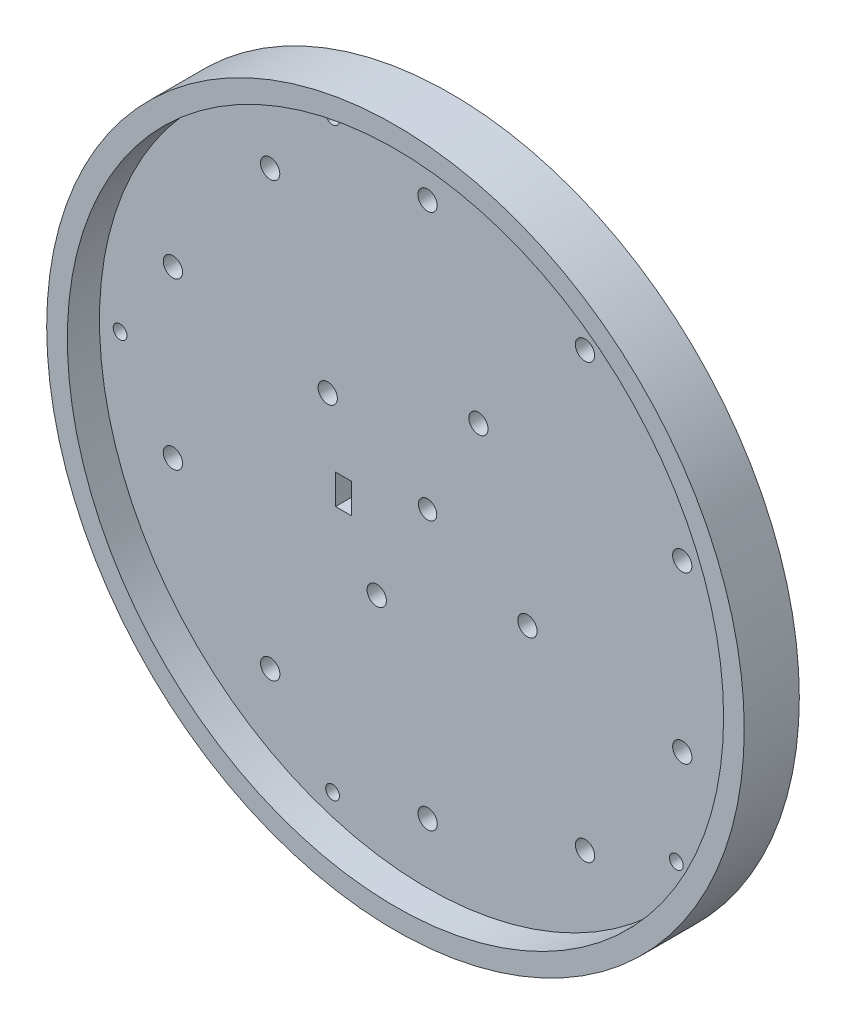
ISO-10303-21;
HEADER;
FILE_DESCRIPTION(('STEP AP214'),'2;1');
FILE_NAME('part.step','',(''),(''),'','','');
FILE_SCHEMA(('AUTOMOTIVE_DESIGN { 1 0 10303 214 1 1 1 1 }'));
ENDSEC;
DATA;
#1=APPLICATION_CONTEXT('core data for automotive mechanical design processes');
#2=APPLICATION_PROTOCOL_DEFINITION('international standard','automotive_design',2000,#1);
#3=PRODUCT_CONTEXT('',#1,'mechanical');
#4=PRODUCT('Part','Part','',(#3));
#5=PRODUCT_RELATED_PRODUCT_CATEGORY('part','',(#4));
#6=PRODUCT_DEFINITION_FORMATION('','',#4);
#7=PRODUCT_DEFINITION_CONTEXT('part definition',#1,'design');
#8=PRODUCT_DEFINITION('design','',#6,#7);
#9=PRODUCT_DEFINITION_SHAPE('','',#8);
#10=(LENGTH_UNIT() NAMED_UNIT(*) SI_UNIT(.MILLI.,.METRE.));
#11=(NAMED_UNIT(*) PLANE_ANGLE_UNIT() SI_UNIT($,.RADIAN.));
#12=(NAMED_UNIT(*) SI_UNIT($,.STERADIAN.) SOLID_ANGLE_UNIT());
#13=UNCERTAINTY_MEASURE_WITH_UNIT(LENGTH_MEASURE(1.E-05),#10,'distance_accuracy_value','');
#14=(GEOMETRIC_REPRESENTATION_CONTEXT(3) GLOBAL_UNCERTAINTY_ASSIGNED_CONTEXT((#13)) GLOBAL_UNIT_ASSIGNED_CONTEXT((#10,
#11,#12)) REPRESENTATION_CONTEXT('',''));
#15=CARTESIAN_POINT('',(0.,0.,0.));
#16=DIRECTION('',(0.,0.,1.));
#17=DIRECTION('',(1.,0.,0.));
#18=AXIS2_PLACEMENT_3D('',#15,#16,#17);
#19=CARTESIAN_POINT('',(0.,0.,5.));
#20=DIRECTION('',(0.,0.,1.));
#21=DIRECTION('',(1.,0.,0.));
#22=AXIS2_PLACEMENT_3D('',#19,#20,#21);
#23=PLANE('',#22);
#24=DIRECTION('',(0.,-1.,0.));
#25=VECTOR('',#24,1.);
#26=CARTESIAN_POINT('',(-20.0597027707781,-3.,5.));
#27=LINE('',#26,#25);
#28=CARTESIAN_POINT('',(-20.0597027707781,-3.,5.));
#29=VERTEX_POINT('',#28);
#30=CARTESIAN_POINT('',(-20.0597027707781,-9.5,5.));
#31=VERTEX_POINT('',#30);
#32=EDGE_CURVE('E49',#29,#31,#27,.T.);
#33=ORIENTED_EDGE('',*,*,#32,.F.);
#34=DIRECTION('',(-1.,0.,0.));
#35=VECTOR('',#34,1.);
#36=CARTESIAN_POINT('',(-20.0597027707781,-3.,5.));
#37=LINE('',#36,#35);
#38=CARTESIAN_POINT('',(-16.5597027707781,-3.,5.));
#39=VERTEX_POINT('',#38);
#40=EDGE_CURVE('E100',#39,#29,#37,.T.);
#41=ORIENTED_EDGE('',*,*,#40,.F.);
#42=DIRECTION('',(0.,1.,0.));
#43=VECTOR('',#42,1.);
#44=CARTESIAN_POINT('',(-16.5597027707781,-3.,5.));
#45=LINE('',#44,#43);
#46=CARTESIAN_POINT('',(-16.5597027707781,-9.5,5.));
#47=VERTEX_POINT('',#46);
#48=EDGE_CURVE('E108',#47,#39,#45,.T.);
#49=ORIENTED_EDGE('',*,*,#48,.F.);
#50=DIRECTION('',(1.,0.,0.));
#51=VECTOR('',#50,1.);
#52=CARTESIAN_POINT('',(-20.0597027707781,-9.5,5.));
#53=LINE('',#52,#51);
#54=EDGE_CURVE('E84',#31,#47,#53,.T.);
#55=ORIENTED_EDGE('',*,*,#54,.F.);
#56=EDGE_LOOP('',(#33,#41,#49,#55));
#57=FACE_BOUND('',#56,.T.);
#58=CARTESIAN_POINT('',(0.,0.,5.));
#59=DIRECTION('',(0.,0.,1.));
#60=DIRECTION('',(1.,0.,0.));
#61=AXIS2_PLACEMENT_3D('',#58,#59,#60);
#62=CIRCLE('',#61,71.5000000000041);
#63=CARTESIAN_POINT('',(71.5000000000041,0.,5.));
#64=VERTEX_POINT('',#63);
#65=EDGE_CURVE('E117',#64,#64,#62,.F.);
#66=ORIENTED_EDGE('',*,*,#65,.F.);
#67=EDGE_LOOP('',(#66));
#68=FACE_BOUND('',#67,.T.);
#69=CARTESIAN_POINT('',(-55.4973823545052,18.0211834183522,5.));
#70=DIRECTION('',(0.,0.,1.));
#71=DIRECTION('',(1.,0.,0.));
#72=AXIS2_PLACEMENT_3D('',#69,#70,#71);
#73=CIRCLE('',#72,2.1);
#74=CARTESIAN_POINT('',(-53.3973823545052,18.0211834183522,5.));
#75=VERTEX_POINT('',#74);
#76=EDGE_CURVE('E161',#75,#75,#73,.T.);
#77=ORIENTED_EDGE('',*,*,#76,.F.);
#78=EDGE_LOOP('',(#77));
#79=FACE_BOUND('',#78,.T.);
#80=CARTESIAN_POINT('',(21.7597027707781,-11.0822045150241,5.));
#81=DIRECTION('',(0.,0.,1.));
#82=DIRECTION('',(1.,0.,0.));
#83=AXIS2_PLACEMENT_3D('',#80,#81,#82);
#84=CIRCLE('',#83,2.1);
#85=CARTESIAN_POINT('',(23.8597027707781,-11.0822045150241,5.));
#86=VERTEX_POINT('',#85);
#87=EDGE_CURVE('E155',#86,#86,#84,.T.);
#88=ORIENTED_EDGE('',*,*,#87,.F.);
#89=EDGE_LOOP('',(#88));
#90=FACE_BOUND('',#89,.T.);
#91=CARTESIAN_POINT('',(11.082204515024,21.7597027707781,5.));
#92=DIRECTION('',(0.,0.,1.));
#93=DIRECTION('',(1.,0.,0.));
#94=AXIS2_PLACEMENT_3D('',#91,#92,#93);
#95=CIRCLE('',#94,2.1);
#96=CARTESIAN_POINT('',(13.182204515024,21.7597027707781,5.));
#97=VERTEX_POINT('',#96);
#98=EDGE_CURVE('E152',#97,#97,#95,.T.);
#99=ORIENTED_EDGE('',*,*,#98,.F.);
#100=EDGE_LOOP('',(#99));
#101=FACE_BOUND('',#100,.T.);
#102=CARTESIAN_POINT('',(-21.7597027707781,11.0822045150241,5.));
#103=DIRECTION('',(0.,0.,1.));
#104=DIRECTION('',(1.,0.,0.));
#105=AXIS2_PLACEMENT_3D('',#102,#103,#104);
#106=CIRCLE('',#105,2.1);
#107=CARTESIAN_POINT('',(-19.6597027707781,11.0822045150241,5.));
#108=VERTEX_POINT('',#107);
#109=EDGE_CURVE('E149',#108,#108,#106,.T.);
#110=ORIENTED_EDGE('',*,*,#109,.F.);
#111=EDGE_LOOP('',(#110));
#112=FACE_BOUND('',#111,.T.);
#113=CARTESIAN_POINT('',(-11.0822045150241,-21.7597027707781,5.));
#114=DIRECTION('',(0.,0.,1.));
#115=DIRECTION('',(1.,0.,0.));
#116=AXIS2_PLACEMENT_3D('',#113,#114,#115);
#117=CIRCLE('',#116,2.1);
#118=CARTESIAN_POINT('',(-8.98220451502408,-21.7597027707781,5.));
#119=VERTEX_POINT('',#118);
#120=EDGE_CURVE('E146',#119,#119,#117,.T.);
#121=ORIENTED_EDGE('',*,*,#120,.F.);
#122=EDGE_LOOP('',(#121));
#123=FACE_BOUND('',#122,.T.);
#124=CARTESIAN_POINT('',(-55.4909113102841,-18.0410992446198,5.));
#125=DIRECTION('',(0.,0.,1.));
#126=DIRECTION('',(1.,0.,0.));
#127=AXIS2_PLACEMENT_3D('',#124,#125,#126);
#128=CIRCLE('',#127,2.1);
#129=CARTESIAN_POINT('',(-53.3909113102841,-18.0410992446198,5.));
#130=VERTEX_POINT('',#129);
#131=EDGE_CURVE('E142',#130,#130,#128,.T.);
#132=ORIENTED_EDGE('',*,*,#131,.F.);
#133=EDGE_LOOP('',(#132));
#134=FACE_BOUND('',#133,.T.);
#135=CARTESIAN_POINT('',(-34.2887982122405,-47.2122951905571,5.));
#136=DIRECTION('',(0.,0.,1.));
#137=DIRECTION('',(1.,0.,0.));
#138=AXIS2_PLACEMENT_3D('',#135,#136,#137);
#139=CIRCLE('',#138,2.1);
#140=CARTESIAN_POINT('',(-32.1887982122404,-47.2122951905571,5.));
#141=VERTEX_POINT('',#140);
#142=EDGE_CURVE('E145',#141,#141,#139,.T.);
#143=ORIENTED_EDGE('',*,*,#142,.F.);
#144=EDGE_LOOP('',(#143));
#145=FACE_BOUND('',#144,.T.);
#146=CARTESIAN_POINT('',(0.0104703694924525,-58.3499990605947,5.));
#147=DIRECTION('',(0.,0.,1.));
#148=DIRECTION('',(1.,0.,0.));
#149=AXIS2_PLACEMENT_3D('',#146,#147,#148);
#150=CIRCLE('',#149,2.1);
#151=CARTESIAN_POINT('',(2.11047036949245,-58.3499990605947,5.));
#152=VERTEX_POINT('',#151);
#153=EDGE_CURVE('E177',#152,#152,#150,.T.);
#154=ORIENTED_EDGE('',*,*,#153,.F.);
#155=EDGE_LOOP('',(#154));
#156=FACE_BOUND('',#155,.T.);
#157=CARTESIAN_POINT('',(34.305739625954,-47.1999865330096,5.));
#158=DIRECTION('',(0.,0.,1.));
#159=DIRECTION('',(1.,0.,0.));
#160=AXIS2_PLACEMENT_3D('',#157,#158,#159);
#161=CIRCLE('',#160,2.1);
#162=CARTESIAN_POINT('',(36.405739625954,-47.1999865330096,5.));
#163=VERTEX_POINT('',#162);
#164=EDGE_CURVE('E174',#163,#163,#161,.T.);
#165=ORIENTED_EDGE('',*,*,#164,.F.);
#166=EDGE_LOOP('',(#165));
#167=FACE_BOUND('',#166,.T.);
#168=CARTESIAN_POINT('',(55.4973823545052,-18.0211834183522,5.));
#169=DIRECTION('',(0.,0.,1.));
#170=DIRECTION('',(1.,0.,0.));
#171=AXIS2_PLACEMENT_3D('',#168,#169,#170);
#172=CIRCLE('',#171,2.09999999999999);
#173=CARTESIAN_POINT('',(57.5973823545052,-18.0211834183522,5.));
#174=VERTEX_POINT('',#173);
#175=EDGE_CURVE('E171',#174,#174,#172,.T.);
#176=ORIENTED_EDGE('',*,*,#175,.F.);
#177=EDGE_LOOP('',(#176));
#178=FACE_BOUND('',#177,.T.);
#179=CARTESIAN_POINT('',(55.4909113102841,18.0410992446198,5.));
#180=DIRECTION('',(0.,0.,1.));
#181=DIRECTION('',(1.,0.,0.));
#182=AXIS2_PLACEMENT_3D('',#179,#180,#181);
#183=CIRCLE('',#182,2.09999999999999);
#184=CARTESIAN_POINT('',(57.5909113102841,18.0410992446198,5.));
#185=VERTEX_POINT('',#184);
#186=EDGE_CURVE('E168',#185,#185,#183,.T.);
#187=ORIENTED_EDGE('',*,*,#186,.F.);
#188=EDGE_LOOP('',(#187));
#189=FACE_BOUND('',#188,.T.);
#190=CARTESIAN_POINT('',(34.2887982122404,47.2122951905571,5.));
#191=DIRECTION('',(0.,0.,1.));
#192=DIRECTION('',(1.,0.,0.));
#193=AXIS2_PLACEMENT_3D('',#190,#191,#192);
#194=CIRCLE('',#193,2.09999999999999);
#195=CARTESIAN_POINT('',(36.3887982122404,47.2122951905571,5.));
#196=VERTEX_POINT('',#195);
#197=EDGE_CURVE('E165',#196,#196,#194,.T.);
#198=ORIENTED_EDGE('',*,*,#197,.F.);
#199=EDGE_LOOP('',(#198));
#200=FACE_BOUND('',#199,.T.);
#201=CARTESIAN_POINT('',(-0.0104703694924799,58.3499990605947,5.));
#202=DIRECTION('',(0.,0.,1.));
#203=DIRECTION('',(1.,0.,0.));
#204=AXIS2_PLACEMENT_3D('',#201,#202,#203);
#205=CIRCLE('',#204,2.1);
#206=CARTESIAN_POINT('',(2.08952963050752,58.3499990605947,5.));
#207=VERTEX_POINT('',#206);
#208=EDGE_CURVE('E162',#207,#207,#205,.T.);
#209=ORIENTED_EDGE('',*,*,#208,.F.);
#210=EDGE_LOOP('',(#209));
#211=FACE_BOUND('',#210,.T.);
#212=CARTESIAN_POINT('',(-34.305739625954,47.1999865330096,5.));
#213=DIRECTION('',(0.,0.,1.));
#214=DIRECTION('',(1.,0.,0.));
#215=AXIS2_PLACEMENT_3D('',#212,#213,#214);
#216=CIRCLE('',#215,2.1);
#217=CARTESIAN_POINT('',(-32.205739625954,47.1999865330096,5.));
#218=VERTEX_POINT('',#217);
#219=EDGE_CURVE('E158',#218,#218,#216,.T.);
#220=ORIENTED_EDGE('',*,*,#219,.F.);
#221=EDGE_LOOP('',(#220));
#222=FACE_BOUND('',#221,.T.);
#223=CARTESIAN_POINT('',(0.,0.,5.));
#224=DIRECTION('',(0.,0.,1.));
#225=DIRECTION('',(1.,0.,0.));
#226=AXIS2_PLACEMENT_3D('',#223,#224,#225);
#227=CIRCLE('',#226,2.);
#228=CARTESIAN_POINT('',(2.,0.,5.));
#229=VERTEX_POINT('',#228);
#230=EDGE_CURVE('E128',#229,#229,#227,.T.);
#231=ORIENTED_EDGE('',*,*,#230,.F.);
#232=EDGE_LOOP('',(#231));
#233=FACE_BOUND('',#232,.T.);
#234=CARTESIAN_POINT('',(-67.,0.,5.));
#235=DIRECTION('',(0.,0.,1.));
#236=DIRECTION('',(1.,0.,0.));
#237=AXIS2_PLACEMENT_3D('',#234,#235,#236);
#238=CIRCLE('',#237,1.5);
#239=CARTESIAN_POINT('',(-65.5,0.,5.));
#240=VERTEX_POINT('',#239);
#241=EDGE_CURVE('E131',#240,#240,#238,.T.);
#242=ORIENTED_EDGE('',*,*,#241,.F.);
#243=EDGE_LOOP('',(#242));
#244=FACE_BOUND('',#243,.T.);
#245=CARTESIAN_POINT('',(-20.7041386231214,-63.7207865917753,5.));
#246=DIRECTION('',(0.,0.,1.));
#247=DIRECTION('',(1.,0.,0.));
#248=AXIS2_PLACEMENT_3D('',#245,#246,#247);
#249=CIRCLE('',#248,1.5);
#250=CARTESIAN_POINT('',(-19.2041386231214,-63.7207865917753,5.));
#251=VERTEX_POINT('',#250);
#252=EDGE_CURVE('E124',#251,#251,#249,.T.);
#253=ORIENTED_EDGE('',*,*,#252,.F.);
#254=EDGE_LOOP('',(#253));
#255=FACE_BOUND('',#254,.T.);
#256=CARTESIAN_POINT('',(54.2041386231215,-39.3816119035956,5.));
#257=DIRECTION('',(0.,0.,1.));
#258=DIRECTION('',(1.,0.,0.));
#259=AXIS2_PLACEMENT_3D('',#256,#257,#258);
#260=CIRCLE('',#259,1.5);
#261=CARTESIAN_POINT('',(55.7041386231215,-39.3816119035956,5.));
#262=VERTEX_POINT('',#261);
#263=EDGE_CURVE('E123',#262,#262,#260,.T.);
#264=ORIENTED_EDGE('',*,*,#263,.F.);
#265=EDGE_LOOP('',(#264));
#266=FACE_BOUND('',#265,.T.);
#267=CARTESIAN_POINT('',(54.2041386231215,39.3816119035958,5.));
#268=DIRECTION('',(0.,0.,1.));
#269=DIRECTION('',(1.,0.,0.));
#270=AXIS2_PLACEMENT_3D('',#267,#268,#269);
#271=CIRCLE('',#270,1.5);
#272=CARTESIAN_POINT('',(55.7041386231215,39.3816119035958,5.));
#273=VERTEX_POINT('',#272);
#274=EDGE_CURVE('E137',#273,#273,#271,.T.);
#275=ORIENTED_EDGE('',*,*,#274,.F.);
#276=EDGE_LOOP('',(#275));
#277=FACE_BOUND('',#276,.T.);
#278=CARTESIAN_POINT('',(-20.7041386231215,63.7207865917753,5.));
#279=DIRECTION('',(0.,0.,1.));
#280=DIRECTION('',(1.,0.,0.));
#281=AXIS2_PLACEMENT_3D('',#278,#279,#280);
#282=CIRCLE('',#281,1.5);
#283=CARTESIAN_POINT('',(-19.2041386231215,63.7207865917753,5.));
#284=VERTEX_POINT('',#283);
#285=EDGE_CURVE('E134',#284,#284,#282,.T.);
#286=ORIENTED_EDGE('',*,*,#285,.F.);
#287=EDGE_LOOP('',(#286));
#288=FACE_BOUND('',#287,.T.);
#289=ADVANCED_FACE('F32',(#57,#68,#79,#90,#101,#112,#123,#134,#145,#156,#167,#178,#189,#200,
#211,#222,#233,#244,#255,#266,#277,#288),#23,.T.);
#290=CARTESIAN_POINT('',(0.,0.,5.));
#291=DIRECTION('',(0.,0.,-1.));
#292=DIRECTION('',(-1.,0.,0.));
#293=AXIS2_PLACEMENT_3D('',#290,#291,#292);
#294=CYLINDRICAL_SURFACE('',#293,76.);
#295=CARTESIAN_POINT('',(0.,0.,0.));
#296=DIRECTION('',(0.,0.,1.));
#297=DIRECTION('',(1.,0.,0.));
#298=AXIS2_PLACEMENT_3D('',#295,#296,#297);
#299=CIRCLE('',#298,76.);
#300=CARTESIAN_POINT('',(76.,0.,0.));
#301=VERTEX_POINT('',#300);
#302=EDGE_CURVE('E11',#301,#301,#299,.T.);
#303=ORIENTED_EDGE('',*,*,#302,.T.);
#304=EDGE_LOOP('',(#303));
#305=FACE_BOUND('',#304,.T.);
#306=CARTESIAN_POINT('',(0.,0.,12.));
#307=DIRECTION('',(0.,0.,1.));
#308=DIRECTION('',(1.,0.,0.));
#309=AXIS2_PLACEMENT_3D('',#306,#307,#308);
#310=CIRCLE('',#309,76.);
#311=CARTESIAN_POINT('',(76.,0.,12.));
#312=VERTEX_POINT('',#311);
#313=EDGE_CURVE('E120',#312,#312,#310,.T.);
#314=ORIENTED_EDGE('',*,*,#313,.F.);
#315=EDGE_LOOP('',(#314));
#316=FACE_BOUND('',#315,.T.);
#317=ADVANCED_FACE('F34',(#305,#316),#294,.T.);
#318=CARTESIAN_POINT('',(0.,0.,0.));
#319=DIRECTION('',(0.,0.,1.));
#320=DIRECTION('',(1.,0.,0.));
#321=AXIS2_PLACEMENT_3D('',#318,#319,#320);
#322=PLANE('',#321);
#323=CARTESIAN_POINT('',(67.,0.,0.));
#324=DIRECTION('',(0.,0.,-1.));
#325=DIRECTION('',(-1.,0.,0.));
#326=AXIS2_PLACEMENT_3D('',#323,#324,#325);
#327=CIRCLE('',#326,2.54999999999999);
#328=CARTESIAN_POINT('',(64.45,0.,0.));
#329=VERTEX_POINT('',#328);
#330=EDGE_CURVE('E285',#329,#329,#327,.T.);
#331=ORIENTED_EDGE('',*,*,#330,.F.);
#332=EDGE_LOOP('',(#331));
#333=FACE_BOUND('',#332,.T.);
#334=CARTESIAN_POINT('',(-20.7041386231214,-63.7207865917753,0.));
#335=DIRECTION('',(0.,0.,1.));
#336=DIRECTION('',(1.,0.,0.));
#337=AXIS2_PLACEMENT_3D('',#334,#335,#336);
#338=CIRCLE('',#337,1.5);
#339=CARTESIAN_POINT('',(-19.2041386231214,-63.7207865917753,0.));
#340=VERTEX_POINT('',#339);
#341=EDGE_CURVE('E36',#340,#340,#338,.T.);
#342=ORIENTED_EDGE('',*,*,#341,.T.);
#343=EDGE_LOOP('',(#342));
#344=FACE_BOUND('',#343,.T.);
#345=CARTESIAN_POINT('',(0.,0.,0.));
#346=DIRECTION('',(0.,0.,1.));
#347=DIRECTION('',(1.,0.,0.));
#348=AXIS2_PLACEMENT_3D('',#345,#346,#347);
#349=CIRCLE('',#348,2.);
#350=CARTESIAN_POINT('',(2.,0.,0.));
#351=VERTEX_POINT('',#350);
#352=EDGE_CURVE('E235',#351,#351,#349,.T.);
#353=ORIENTED_EDGE('',*,*,#352,.T.);
#354=EDGE_LOOP('',(#353));
#355=FACE_BOUND('',#354,.T.);
#356=CARTESIAN_POINT('',(-67.,0.,0.));
#357=DIRECTION('',(0.,0.,1.));
#358=DIRECTION('',(1.,0.,0.));
#359=AXIS2_PLACEMENT_3D('',#356,#357,#358);
#360=CIRCLE('',#359,1.5);
#361=CARTESIAN_POINT('',(-65.5,0.,0.));
#362=VERTEX_POINT('',#361);
#363=EDGE_CURVE('E233',#362,#362,#360,.T.);
#364=ORIENTED_EDGE('',*,*,#363,.T.);
#365=EDGE_LOOP('',(#364));
#366=FACE_BOUND('',#365,.T.);
#367=CARTESIAN_POINT('',(-20.7041386231215,63.7207865917753,0.));
#368=DIRECTION('',(0.,0.,1.));
#369=DIRECTION('',(1.,0.,0.));
#370=AXIS2_PLACEMENT_3D('',#367,#368,#369);
#371=CIRCLE('',#370,1.5);
#372=CARTESIAN_POINT('',(-19.2041386231215,63.7207865917753,0.));
#373=VERTEX_POINT('',#372);
#374=EDGE_CURVE('E230',#373,#373,#371,.T.);
#375=ORIENTED_EDGE('',*,*,#374,.T.);
#376=EDGE_LOOP('',(#375));
#377=FACE_BOUND('',#376,.T.);
#378=CARTESIAN_POINT('',(54.2041386231215,39.3816119035958,0.));
#379=DIRECTION('',(0.,0.,1.));
#380=DIRECTION('',(1.,0.,0.));
#381=AXIS2_PLACEMENT_3D('',#378,#379,#380);
#382=CIRCLE('',#381,1.5);
#383=CARTESIAN_POINT('',(55.7041386231215,39.3816119035958,0.));
#384=VERTEX_POINT('',#383);
#385=EDGE_CURVE('E227',#384,#384,#382,.T.);
#386=ORIENTED_EDGE('',*,*,#385,.T.);
#387=EDGE_LOOP('',(#386));
#388=FACE_BOUND('',#387,.T.);
#389=CARTESIAN_POINT('',(54.2041386231215,-39.3816119035956,0.));
#390=DIRECTION('',(0.,0.,1.));
#391=DIRECTION('',(1.,0.,0.));
#392=AXIS2_PLACEMENT_3D('',#389,#390,#391);
#393=CIRCLE('',#392,1.5);
#394=CARTESIAN_POINT('',(55.7041386231215,-39.3816119035956,0.));
#395=VERTEX_POINT('',#394);
#396=EDGE_CURVE('E127',#395,#395,#393,.T.);
#397=ORIENTED_EDGE('',*,*,#396,.T.);
#398=EDGE_LOOP('',(#397));
#399=FACE_BOUND('',#398,.T.);
#400=CARTESIAN_POINT('',(-34.305739625954,47.1999865330096,0.));
#401=DIRECTION('',(0.,0.,1.));
#402=DIRECTION('',(1.,0.,0.));
#403=AXIS2_PLACEMENT_3D('',#400,#401,#402);
#404=CIRCLE('',#403,2.1);
#405=CARTESIAN_POINT('',(-32.205739625954,47.1999865330096,0.));
#406=VERTEX_POINT('',#405);
#407=EDGE_CURVE('E41',#406,#406,#404,.T.);
#408=ORIENTED_EDGE('',*,*,#407,.T.);
#409=EDGE_LOOP('',(#408));
#410=FACE_BOUND('',#409,.T.);
#411=CARTESIAN_POINT('',(-0.0104703694924799,58.3499990605947,0.));
#412=DIRECTION('',(0.,0.,1.));
#413=DIRECTION('',(1.,0.,0.));
#414=AXIS2_PLACEMENT_3D('',#411,#412,#413);
#415=CIRCLE('',#414,2.1);
#416=CARTESIAN_POINT('',(2.08952963050752,58.3499990605947,0.));
#417=VERTEX_POINT('',#416);
#418=EDGE_CURVE('E220',#417,#417,#415,.T.);
#419=ORIENTED_EDGE('',*,*,#418,.T.);
#420=EDGE_LOOP('',(#419));
#421=FACE_BOUND('',#420,.T.);
#422=CARTESIAN_POINT('',(34.2887982122404,47.2122951905571,0.));
#423=DIRECTION('',(0.,0.,1.));
#424=DIRECTION('',(1.,0.,0.));
#425=AXIS2_PLACEMENT_3D('',#422,#423,#424);
#426=CIRCLE('',#425,2.09999999999999);
#427=CARTESIAN_POINT('',(36.3887982122404,47.2122951905571,0.));
#428=VERTEX_POINT('',#427);
#429=EDGE_CURVE('E217',#428,#428,#426,.T.);
#430=ORIENTED_EDGE('',*,*,#429,.T.);
#431=EDGE_LOOP('',(#430));
#432=FACE_BOUND('',#431,.T.);
#433=CARTESIAN_POINT('',(55.4909113102841,18.0410992446198,0.));
#434=DIRECTION('',(0.,0.,1.));
#435=DIRECTION('',(1.,0.,0.));
#436=AXIS2_PLACEMENT_3D('',#433,#434,#435);
#437=CIRCLE('',#436,2.09999999999999);
#438=CARTESIAN_POINT('',(57.5909113102841,18.0410992446198,0.));
#439=VERTEX_POINT('',#438);
#440=EDGE_CURVE('E214',#439,#439,#437,.T.);
#441=ORIENTED_EDGE('',*,*,#440,.T.);
#442=EDGE_LOOP('',(#441));
#443=FACE_BOUND('',#442,.T.);
#444=CARTESIAN_POINT('',(55.4973823545052,-18.0211834183522,0.));
#445=DIRECTION('',(0.,0.,1.));
#446=DIRECTION('',(1.,0.,0.));
#447=AXIS2_PLACEMENT_3D('',#444,#445,#446);
#448=CIRCLE('',#447,2.09999999999999);
#449=CARTESIAN_POINT('',(57.5973823545052,-18.0211834183522,0.));
#450=VERTEX_POINT('',#449);
#451=EDGE_CURVE('E211',#450,#450,#448,.T.);
#452=ORIENTED_EDGE('',*,*,#451,.T.);
#453=EDGE_LOOP('',(#452));
#454=FACE_BOUND('',#453,.T.);
#455=CARTESIAN_POINT('',(34.305739625954,-47.1999865330096,0.));
#456=DIRECTION('',(0.,0.,1.));
#457=DIRECTION('',(1.,0.,0.));
#458=AXIS2_PLACEMENT_3D('',#455,#456,#457);
#459=CIRCLE('',#458,2.1);
#460=CARTESIAN_POINT('',(36.405739625954,-47.1999865330096,0.));
#461=VERTEX_POINT('',#460);
#462=EDGE_CURVE('E208',#461,#461,#459,.T.);
#463=ORIENTED_EDGE('',*,*,#462,.T.);
#464=EDGE_LOOP('',(#463));
#465=FACE_BOUND('',#464,.T.);
#466=CARTESIAN_POINT('',(0.0104703694924525,-58.3499990605947,0.));
#467=DIRECTION('',(0.,0.,1.));
#468=DIRECTION('',(1.,0.,0.));
#469=AXIS2_PLACEMENT_3D('',#466,#467,#468);
#470=CIRCLE('',#469,2.1);
#471=CARTESIAN_POINT('',(2.11047036949245,-58.3499990605947,0.));
#472=VERTEX_POINT('',#471);
#473=EDGE_CURVE('E205',#472,#472,#470,.T.);
#474=ORIENTED_EDGE('',*,*,#473,.T.);
#475=EDGE_LOOP('',(#474));
#476=FACE_BOUND('',#475,.T.);
#477=CARTESIAN_POINT('',(-34.2887982122405,-47.2122951905571,0.));
#478=DIRECTION('',(0.,0.,1.));
#479=DIRECTION('',(1.,0.,0.));
#480=AXIS2_PLACEMENT_3D('',#477,#478,#479);
#481=CIRCLE('',#480,2.1);
#482=CARTESIAN_POINT('',(-32.1887982122404,-47.2122951905571,0.));
#483=VERTEX_POINT('',#482);
#484=EDGE_CURVE('E202',#483,#483,#481,.T.);
#485=ORIENTED_EDGE('',*,*,#484,.T.);
#486=EDGE_LOOP('',(#485));
#487=FACE_BOUND('',#486,.T.);
#488=CARTESIAN_POINT('',(-55.4909113102841,-18.0410992446198,0.));
#489=DIRECTION('',(0.,0.,1.));
#490=DIRECTION('',(1.,0.,0.));
#491=AXIS2_PLACEMENT_3D('',#488,#489,#490);
#492=CIRCLE('',#491,2.1);
#493=CARTESIAN_POINT('',(-53.3909113102841,-18.0410992446198,0.));
#494=VERTEX_POINT('',#493);
#495=EDGE_CURVE('E199',#494,#494,#492,.T.);
#496=ORIENTED_EDGE('',*,*,#495,.T.);
#497=EDGE_LOOP('',(#496));
#498=FACE_BOUND('',#497,.T.);
#499=CARTESIAN_POINT('',(-11.0822045150241,-21.7597027707781,0.));
#500=DIRECTION('',(0.,0.,1.));
#501=DIRECTION('',(1.,0.,0.));
#502=AXIS2_PLACEMENT_3D('',#499,#500,#501);
#503=CIRCLE('',#502,2.1);
#504=CARTESIAN_POINT('',(-8.98220451502408,-21.7597027707781,0.));
#505=VERTEX_POINT('',#504);
#506=EDGE_CURVE('E196',#505,#505,#503,.T.);
#507=ORIENTED_EDGE('',*,*,#506,.T.);
#508=EDGE_LOOP('',(#507));
#509=FACE_BOUND('',#508,.T.);
#510=CARTESIAN_POINT('',(-21.7597027707781,11.0822045150241,0.));
#511=DIRECTION('',(0.,0.,1.));
#512=DIRECTION('',(1.,0.,0.));
#513=AXIS2_PLACEMENT_3D('',#510,#511,#512);
#514=CIRCLE('',#513,2.1);
#515=CARTESIAN_POINT('',(-19.6597027707781,11.0822045150241,0.));
#516=VERTEX_POINT('',#515);
#517=EDGE_CURVE('E193',#516,#516,#514,.T.);
#518=ORIENTED_EDGE('',*,*,#517,.T.);
#519=EDGE_LOOP('',(#518));
#520=FACE_BOUND('',#519,.T.);
#521=CARTESIAN_POINT('',(11.082204515024,21.7597027707781,0.));
#522=DIRECTION('',(0.,0.,1.));
#523=DIRECTION('',(1.,0.,0.));
#524=AXIS2_PLACEMENT_3D('',#521,#522,#523);
#525=CIRCLE('',#524,2.1);
#526=CARTESIAN_POINT('',(13.182204515024,21.7597027707781,0.));
#527=VERTEX_POINT('',#526);
#528=EDGE_CURVE('E190',#527,#527,#525,.T.);
#529=ORIENTED_EDGE('',*,*,#528,.T.);
#530=EDGE_LOOP('',(#529));
#531=FACE_BOUND('',#530,.T.);
#532=CARTESIAN_POINT('',(21.7597027707781,-11.0822045150241,0.));
#533=DIRECTION('',(0.,0.,1.));
#534=DIRECTION('',(1.,0.,0.));
#535=AXIS2_PLACEMENT_3D('',#532,#533,#534);
#536=CIRCLE('',#535,2.1);
#537=CARTESIAN_POINT('',(23.8597027707781,-11.0822045150241,0.));
#538=VERTEX_POINT('',#537);
#539=EDGE_CURVE('E187',#538,#538,#536,.T.);
#540=ORIENTED_EDGE('',*,*,#539,.T.);
#541=EDGE_LOOP('',(#540));
#542=FACE_BOUND('',#541,.T.);
#543=CARTESIAN_POINT('',(-55.4973823545052,18.0211834183522,0.));
#544=DIRECTION('',(0.,0.,1.));
#545=DIRECTION('',(1.,0.,0.));
#546=AXIS2_PLACEMENT_3D('',#543,#544,#545);
#547=CIRCLE('',#546,2.1);
#548=CARTESIAN_POINT('',(-53.3973823545052,18.0211834183522,0.));
#549=VERTEX_POINT('',#548);
#550=EDGE_CURVE('E183',#549,#549,#547,.T.);
#551=ORIENTED_EDGE('',*,*,#550,.T.);
#552=EDGE_LOOP('',(#551));
#553=FACE_BOUND('',#552,.T.);
#554=ORIENTED_EDGE('',*,*,#302,.F.);
#555=EDGE_LOOP('',(#554));
#556=FACE_BOUND('',#555,.T.);
#557=ADVANCED_FACE('F242',(#333,#344,#355,#366,#377,#388,#399,#410,#421,#432,#443,#454,#465,
#476,#487,#498,#509,#520,#531,#542,#553,#556),#322,.F.);
#558=CARTESIAN_POINT('',(-55.4973823545052,18.0211834183522,-5.));
#559=DIRECTION('',(0.,0.,1.));
#560=DIRECTION('',(1.,0.,0.));
#561=AXIS2_PLACEMENT_3D('',#558,#559,#560);
#562=CYLINDRICAL_SURFACE('',#561,2.1);
#563=ORIENTED_EDGE('',*,*,#76,.T.);
#564=EDGE_LOOP('',(#563));
#565=FACE_BOUND('',#564,.T.);
#566=ORIENTED_EDGE('',*,*,#550,.F.);
#567=EDGE_LOOP('',(#566));
#568=FACE_BOUND('',#567,.T.);
#569=ADVANCED_FACE('F272',(#565,#568),#562,.F.);
#570=CARTESIAN_POINT('',(21.7597027707781,-11.0822045150241,-5.));
#571=DIRECTION('',(0.,0.,1.));
#572=DIRECTION('',(1.,0.,0.));
#573=AXIS2_PLACEMENT_3D('',#570,#571,#572);
#574=CYLINDRICAL_SURFACE('',#573,2.1);
#575=ORIENTED_EDGE('',*,*,#87,.T.);
#576=EDGE_LOOP('',(#575));
#577=FACE_BOUND('',#576,.T.);
#578=ORIENTED_EDGE('',*,*,#539,.F.);
#579=EDGE_LOOP('',(#578));
#580=FACE_BOUND('',#579,.T.);
#581=ADVANCED_FACE('F281',(#577,#580),#574,.F.);
#582=CARTESIAN_POINT('',(11.082204515024,21.7597027707781,-5.));
#583=DIRECTION('',(0.,0.,1.));
#584=DIRECTION('',(1.,0.,0.));
#585=AXIS2_PLACEMENT_3D('',#582,#583,#584);
#586=CYLINDRICAL_SURFACE('',#585,2.1);
#587=ORIENTED_EDGE('',*,*,#98,.T.);
#588=EDGE_LOOP('',(#587));
#589=FACE_BOUND('',#588,.T.);
#590=ORIENTED_EDGE('',*,*,#528,.F.);
#591=EDGE_LOOP('',(#590));
#592=FACE_BOUND('',#591,.T.);
#593=ADVANCED_FACE('F406',(#589,#592),#586,.F.);
#594=CARTESIAN_POINT('',(-21.7597027707781,11.0822045150241,-5.));
#595=DIRECTION('',(0.,0.,1.));
#596=DIRECTION('',(1.,0.,0.));
#597=AXIS2_PLACEMENT_3D('',#594,#595,#596);
#598=CYLINDRICAL_SURFACE('',#597,2.1);
#599=ORIENTED_EDGE('',*,*,#109,.T.);
#600=EDGE_LOOP('',(#599));
#601=FACE_BOUND('',#600,.T.);
#602=ORIENTED_EDGE('',*,*,#517,.F.);
#603=EDGE_LOOP('',(#602));
#604=FACE_BOUND('',#603,.T.);
#605=ADVANCED_FACE('F412',(#601,#604),#598,.F.);
#606=CARTESIAN_POINT('',(-11.0822045150241,-21.7597027707781,-5.));
#607=DIRECTION('',(0.,0.,1.));
#608=DIRECTION('',(1.,0.,0.));
#609=AXIS2_PLACEMENT_3D('',#606,#607,#608);
#610=CYLINDRICAL_SURFACE('',#609,2.1);
#611=ORIENTED_EDGE('',*,*,#120,.T.);
#612=EDGE_LOOP('',(#611));
#613=FACE_BOUND('',#612,.T.);
#614=ORIENTED_EDGE('',*,*,#506,.F.);
#615=EDGE_LOOP('',(#614));
#616=FACE_BOUND('',#615,.T.);
#617=ADVANCED_FACE('F452',(#613,#616),#610,.F.);
#618=CARTESIAN_POINT('',(-55.4909113102841,-18.0410992446198,-5.));
#619=DIRECTION('',(0.,0.,1.));
#620=DIRECTION('',(1.,0.,0.));
#621=AXIS2_PLACEMENT_3D('',#618,#619,#620);
#622=CYLINDRICAL_SURFACE('',#621,2.1);
#623=ORIENTED_EDGE('',*,*,#131,.T.);
#624=EDGE_LOOP('',(#623));
#625=FACE_BOUND('',#624,.T.);
#626=ORIENTED_EDGE('',*,*,#495,.F.);
#627=EDGE_LOOP('',(#626));
#628=FACE_BOUND('',#627,.T.);
#629=ADVANCED_FACE('F447',(#625,#628),#622,.F.);
#630=CARTESIAN_POINT('',(-34.2887982122405,-47.2122951905571,-5.));
#631=DIRECTION('',(0.,0.,1.));
#632=DIRECTION('',(1.,0.,0.));
#633=AXIS2_PLACEMENT_3D('',#630,#631,#632);
#634=CYLINDRICAL_SURFACE('',#633,2.1);
#635=ORIENTED_EDGE('',*,*,#142,.T.);
#636=EDGE_LOOP('',(#635));
#637=FACE_BOUND('',#636,.T.);
#638=ORIENTED_EDGE('',*,*,#484,.F.);
#639=EDGE_LOOP('',(#638));
#640=FACE_BOUND('',#639,.T.);
#641=ADVANCED_FACE('F444',(#637,#640),#634,.F.);
#642=CARTESIAN_POINT('',(0.0104703694924525,-58.3499990605947,-5.));
#643=DIRECTION('',(0.,0.,1.));
#644=DIRECTION('',(1.,0.,0.));
#645=AXIS2_PLACEMENT_3D('',#642,#643,#644);
#646=CYLINDRICAL_SURFACE('',#645,2.1);
#647=ORIENTED_EDGE('',*,*,#153,.T.);
#648=EDGE_LOOP('',(#647));
#649=FACE_BOUND('',#648,.T.);
#650=ORIENTED_EDGE('',*,*,#473,.F.);
#651=EDGE_LOOP('',(#650));
#652=FACE_BOUND('',#651,.T.);
#653=ADVANCED_FACE('F441',(#649,#652),#646,.F.);
#654=CARTESIAN_POINT('',(34.305739625954,-47.1999865330096,-5.));
#655=DIRECTION('',(0.,0.,1.));
#656=DIRECTION('',(1.,0.,0.));
#657=AXIS2_PLACEMENT_3D('',#654,#655,#656);
#658=CYLINDRICAL_SURFACE('',#657,2.1);
#659=ORIENTED_EDGE('',*,*,#164,.T.);
#660=EDGE_LOOP('',(#659));
#661=FACE_BOUND('',#660,.T.);
#662=ORIENTED_EDGE('',*,*,#462,.F.);
#663=EDGE_LOOP('',(#662));
#664=FACE_BOUND('',#663,.T.);
#665=ADVANCED_FACE('F437',(#661,#664),#658,.F.);
#666=CARTESIAN_POINT('',(55.4973823545052,-18.0211834183522,-5.));
#667=DIRECTION('',(0.,0.,1.));
#668=DIRECTION('',(1.,0.,0.));
#669=AXIS2_PLACEMENT_3D('',#666,#667,#668);
#670=CYLINDRICAL_SURFACE('',#669,2.09999999999999);
#671=ORIENTED_EDGE('',*,*,#175,.T.);
#672=EDGE_LOOP('',(#671));
#673=FACE_BOUND('',#672,.T.);
#674=ORIENTED_EDGE('',*,*,#451,.F.);
#675=EDGE_LOOP('',(#674));
#676=FACE_BOUND('',#675,.T.);
#677=ADVANCED_FACE('F433',(#673,#676),#670,.F.);
#678=CARTESIAN_POINT('',(55.4909113102841,18.0410992446198,-5.));
#679=DIRECTION('',(0.,0.,1.));
#680=DIRECTION('',(1.,0.,0.));
#681=AXIS2_PLACEMENT_3D('',#678,#679,#680);
#682=CYLINDRICAL_SURFACE('',#681,2.09999999999999);
#683=ORIENTED_EDGE('',*,*,#186,.T.);
#684=EDGE_LOOP('',(#683));
#685=FACE_BOUND('',#684,.T.);
#686=ORIENTED_EDGE('',*,*,#440,.F.);
#687=EDGE_LOOP('',(#686));
#688=FACE_BOUND('',#687,.T.);
#689=ADVANCED_FACE('F429',(#685,#688),#682,.F.);
#690=CARTESIAN_POINT('',(34.2887982122404,47.2122951905571,-5.));
#691=DIRECTION('',(0.,0.,1.));
#692=DIRECTION('',(1.,0.,0.));
#693=AXIS2_PLACEMENT_3D('',#690,#691,#692);
#694=CYLINDRICAL_SURFACE('',#693,2.09999999999999);
#695=ORIENTED_EDGE('',*,*,#197,.T.);
#696=EDGE_LOOP('',(#695));
#697=FACE_BOUND('',#696,.T.);
#698=ORIENTED_EDGE('',*,*,#429,.F.);
#699=EDGE_LOOP('',(#698));
#700=FACE_BOUND('',#699,.T.);
#701=ADVANCED_FACE('F425',(#697,#700),#694,.F.);
#702=CARTESIAN_POINT('',(-0.0104703694924799,58.3499990605947,-5.));
#703=DIRECTION('',(0.,0.,1.));
#704=DIRECTION('',(1.,0.,0.));
#705=AXIS2_PLACEMENT_3D('',#702,#703,#704);
#706=CYLINDRICAL_SURFACE('',#705,2.1);
#707=ORIENTED_EDGE('',*,*,#208,.T.);
#708=EDGE_LOOP('',(#707));
#709=FACE_BOUND('',#708,.T.);
#710=ORIENTED_EDGE('',*,*,#418,.F.);
#711=EDGE_LOOP('',(#710));
#712=FACE_BOUND('',#711,.T.);
#713=ADVANCED_FACE('F421',(#709,#712),#706,.F.);
#714=CARTESIAN_POINT('',(-34.305739625954,47.1999865330096,-5.));
#715=DIRECTION('',(0.,0.,1.));
#716=DIRECTION('',(1.,0.,0.));
#717=AXIS2_PLACEMENT_3D('',#714,#715,#716);
#718=CYLINDRICAL_SURFACE('',#717,2.1);
#719=ORIENTED_EDGE('',*,*,#219,.T.);
#720=EDGE_LOOP('',(#719));
#721=FACE_BOUND('',#720,.T.);
#722=ORIENTED_EDGE('',*,*,#407,.F.);
#723=EDGE_LOOP('',(#722));
#724=FACE_BOUND('',#723,.T.);
#725=ADVANCED_FACE('F417',(#721,#724),#718,.F.);
#726=CARTESIAN_POINT('',(54.2041386231215,-39.3816119035956,-5.));
#727=DIRECTION('',(0.,0.,1.));
#728=DIRECTION('',(1.,0.,0.));
#729=AXIS2_PLACEMENT_3D('',#726,#727,#728);
#730=CYLINDRICAL_SURFACE('',#729,1.5);
#731=ORIENTED_EDGE('',*,*,#263,.T.);
#732=EDGE_LOOP('',(#731));
#733=FACE_BOUND('',#732,.T.);
#734=ORIENTED_EDGE('',*,*,#396,.F.);
#735=EDGE_LOOP('',(#734));
#736=FACE_BOUND('',#735,.T.);
#737=ADVANCED_FACE('F420',(#733,#736),#730,.F.);
#738=CARTESIAN_POINT('',(54.2041386231215,39.3816119035958,-5.));
#739=DIRECTION('',(0.,0.,1.));
#740=DIRECTION('',(1.,0.,0.));
#741=AXIS2_PLACEMENT_3D('',#738,#739,#740);
#742=CYLINDRICAL_SURFACE('',#741,1.5);
#743=ORIENTED_EDGE('',*,*,#274,.T.);
#744=EDGE_LOOP('',(#743));
#745=FACE_BOUND('',#744,.T.);
#746=ORIENTED_EDGE('',*,*,#385,.F.);
#747=EDGE_LOOP('',(#746));
#748=FACE_BOUND('',#747,.T.);
#749=ADVANCED_FACE('F362',(#745,#748),#742,.F.);
#750=CARTESIAN_POINT('',(-20.7041386231215,63.7207865917753,-5.));
#751=DIRECTION('',(0.,0.,1.));
#752=DIRECTION('',(1.,0.,0.));
#753=AXIS2_PLACEMENT_3D('',#750,#751,#752);
#754=CYLINDRICAL_SURFACE('',#753,1.5);
#755=ORIENTED_EDGE('',*,*,#285,.T.);
#756=EDGE_LOOP('',(#755));
#757=FACE_BOUND('',#756,.T.);
#758=ORIENTED_EDGE('',*,*,#374,.F.);
#759=EDGE_LOOP('',(#758));
#760=FACE_BOUND('',#759,.T.);
#761=ADVANCED_FACE('F359',(#757,#760),#754,.F.);
#762=CARTESIAN_POINT('',(-67.,0.,-5.));
#763=DIRECTION('',(0.,0.,1.));
#764=DIRECTION('',(1.,0.,0.));
#765=AXIS2_PLACEMENT_3D('',#762,#763,#764);
#766=CYLINDRICAL_SURFACE('',#765,1.5);
#767=ORIENTED_EDGE('',*,*,#241,.T.);
#768=EDGE_LOOP('',(#767));
#769=FACE_BOUND('',#768,.T.);
#770=ORIENTED_EDGE('',*,*,#363,.F.);
#771=EDGE_LOOP('',(#770));
#772=FACE_BOUND('',#771,.T.);
#773=ADVANCED_FACE('F258',(#769,#772),#766,.F.);
#774=CARTESIAN_POINT('',(0.,0.,-5.));
#775=DIRECTION('',(0.,0.,1.));
#776=DIRECTION('',(1.,0.,0.));
#777=AXIS2_PLACEMENT_3D('',#774,#775,#776);
#778=CYLINDRICAL_SURFACE('',#777,2.);
#779=ORIENTED_EDGE('',*,*,#230,.T.);
#780=EDGE_LOOP('',(#779));
#781=FACE_BOUND('',#780,.T.);
#782=ORIENTED_EDGE('',*,*,#352,.F.);
#783=EDGE_LOOP('',(#782));
#784=FACE_BOUND('',#783,.T.);
#785=ADVANCED_FACE('F247',(#781,#784),#778,.F.);
#786=CARTESIAN_POINT('',(-20.7041386231214,-63.7207865917753,-5.));
#787=DIRECTION('',(0.,0.,1.));
#788=DIRECTION('',(1.,0.,0.));
#789=AXIS2_PLACEMENT_3D('',#786,#787,#788);
#790=CYLINDRICAL_SURFACE('',#789,1.5);
#791=ORIENTED_EDGE('',*,*,#252,.T.);
#792=EDGE_LOOP('',(#791));
#793=FACE_BOUND('',#792,.T.);
#794=ORIENTED_EDGE('',*,*,#341,.F.);
#795=EDGE_LOOP('',(#794));
#796=FACE_BOUND('',#795,.T.);
#797=ADVANCED_FACE('F244',(#793,#796),#790,.F.);
#798=CARTESIAN_POINT('',(0.,0.,12.));
#799=DIRECTION('',(0.,0.,1.));
#800=DIRECTION('',(1.,0.,0.));
#801=AXIS2_PLACEMENT_3D('',#798,#799,#800);
#802=PLANE('',#801);
#803=CARTESIAN_POINT('',(0.,0.,12.));
#804=DIRECTION('',(0.,0.,1.));
#805=DIRECTION('',(1.,0.,0.));
#806=AXIS2_PLACEMENT_3D('',#803,#804,#805);
#807=CIRCLE('',#806,71.5000000000041);
#808=CARTESIAN_POINT('',(71.5000000000041,0.,12.));
#809=VERTEX_POINT('',#808);
#810=EDGE_CURVE('E112',#809,#809,#807,.T.);
#811=ORIENTED_EDGE('',*,*,#810,.F.);
#812=EDGE_LOOP('',(#811));
#813=FACE_BOUND('',#812,.T.);
#814=ORIENTED_EDGE('',*,*,#313,.T.);
#815=EDGE_LOOP('',(#814));
#816=FACE_BOUND('',#815,.T.);
#817=ADVANCED_FACE('F246',(#813,#816),#802,.T.);
#818=CARTESIAN_POINT('',(0.,0.,-197.232539419364));
#819=DIRECTION('',(0.,0.,1.));
#820=DIRECTION('',(1.,0.,0.));
#821=AXIS2_PLACEMENT_3D('',#818,#819,#820);
#822=CYLINDRICAL_SURFACE('',#821,71.5000000000041);
#823=ORIENTED_EDGE('',*,*,#810,.T.);
#824=EDGE_LOOP('',(#823));
#825=FACE_BOUND('',#824,.T.);
#826=ORIENTED_EDGE('',*,*,#65,.T.);
#827=EDGE_LOOP('',(#826));
#828=FACE_BOUND('',#827,.T.);
#829=ADVANCED_FACE('F255',(#825,#828),#822,.F.);
#830=CARTESIAN_POINT('',(-20.0597027707781,-3.,1.));
#831=DIRECTION('',(-1.,0.,0.));
#832=DIRECTION('',(0.,0.,1.));
#833=AXIS2_PLACEMENT_3D('',#830,#831,#832);
#834=PLANE('',#833);
#835=ORIENTED_EDGE('',*,*,#32,.T.);
#836=DIRECTION('',(0.,0.,1.));
#837=VECTOR('',#836,1.);
#838=CARTESIAN_POINT('',(-20.0597027707781,-9.5,1.));
#839=LINE('',#838,#837);
#840=CARTESIAN_POINT('',(-20.0597027707781,-9.5,1.));
#841=VERTEX_POINT('',#840);
#842=EDGE_CURVE('E72',#841,#31,#839,.T.);
#843=ORIENTED_EDGE('',*,*,#842,.F.);
#844=DIRECTION('',(0.,-1.,0.));
#845=VECTOR('',#844,1.);
#846=CARTESIAN_POINT('',(-20.0597027707781,-3.,1.));
#847=LINE('',#846,#845);
#848=CARTESIAN_POINT('',(-20.0597027707781,-3.,1.));
#849=VERTEX_POINT('',#848);
#850=EDGE_CURVE('E98',#849,#841,#847,.T.);
#851=ORIENTED_EDGE('',*,*,#850,.F.);
#852=DIRECTION('',(0.,0.,1.));
#853=VECTOR('',#852,1.);
#854=CARTESIAN_POINT('',(-20.0597027707781,-3.,1.));
#855=LINE('',#854,#853);
#856=EDGE_CURVE('E57',#849,#29,#855,.T.);
#857=ORIENTED_EDGE('',*,*,#856,.T.);
#858=EDGE_LOOP('',(#835,#843,#851,#857));
#859=FACE_BOUND('',#858,.T.);
#860=ADVANCED_FACE('F305',(#859),#834,.F.);
#861=CARTESIAN_POINT('',(-20.0597027707781,-3.,1.));
#862=DIRECTION('',(0.,1.,0.));
#863=DIRECTION('',(0.,0.,1.));
#864=AXIS2_PLACEMENT_3D('',#861,#862,#863);
#865=PLANE('',#864);
#866=ORIENTED_EDGE('',*,*,#40,.T.);
#867=ORIENTED_EDGE('',*,*,#856,.F.);
#868=DIRECTION('',(-1.,0.,0.));
#869=VECTOR('',#868,1.);
#870=CARTESIAN_POINT('',(-20.0597027707781,-3.,1.));
#871=LINE('',#870,#869);
#872=CARTESIAN_POINT('',(-16.5597027707781,-3.,1.));
#873=VERTEX_POINT('',#872);
#874=EDGE_CURVE('E95',#873,#849,#871,.T.);
#875=ORIENTED_EDGE('',*,*,#874,.F.);
#876=DIRECTION('',(0.,0.,1.));
#877=VECTOR('',#876,1.);
#878=CARTESIAN_POINT('',(-16.5597027707781,-3.,1.));
#879=LINE('',#878,#877);
#880=EDGE_CURVE('E88',#873,#39,#879,.T.);
#881=ORIENTED_EDGE('',*,*,#880,.T.);
#882=EDGE_LOOP('',(#866,#867,#875,#881));
#883=FACE_BOUND('',#882,.T.);
#884=ADVANCED_FACE('F302',(#883),#865,.F.);
#885=CARTESIAN_POINT('',(-16.5597027707781,-3.,1.));
#886=DIRECTION('',(1.,0.,0.));
#887=DIRECTION('',(0.,1.,0.));
#888=AXIS2_PLACEMENT_3D('',#885,#886,#887);
#889=PLANE('',#888);
#890=ORIENTED_EDGE('',*,*,#48,.T.);
#891=ORIENTED_EDGE('',*,*,#880,.F.);
#892=DIRECTION('',(0.,1.,0.));
#893=VECTOR('',#892,1.);
#894=CARTESIAN_POINT('',(-16.5597027707781,-3.,1.));
#895=LINE('',#894,#893);
#896=CARTESIAN_POINT('',(-16.5597027707781,-9.5,1.));
#897=VERTEX_POINT('',#896);
#898=EDGE_CURVE('E91',#897,#873,#895,.T.);
#899=ORIENTED_EDGE('',*,*,#898,.F.);
#900=DIRECTION('',(0.,0.,1.));
#901=VECTOR('',#900,1.);
#902=CARTESIAN_POINT('',(-16.5597027707781,-9.5,1.));
#903=LINE('',#902,#901);
#904=EDGE_CURVE('E77',#897,#47,#903,.T.);
#905=ORIENTED_EDGE('',*,*,#904,.T.);
#906=EDGE_LOOP('',(#890,#891,#899,#905));
#907=FACE_BOUND('',#906,.T.);
#908=ADVANCED_FACE('F92',(#907),#889,.F.);
#909=CARTESIAN_POINT('',(-20.0597027707781,-9.5,1.));
#910=DIRECTION('',(0.,-1.,0.));
#911=DIRECTION('',(0.,0.,-1.));
#912=AXIS2_PLACEMENT_3D('',#909,#910,#911);
#913=PLANE('',#912);
#914=ORIENTED_EDGE('',*,*,#54,.T.);
#915=ORIENTED_EDGE('',*,*,#904,.F.);
#916=DIRECTION('',(1.,0.,0.));
#917=VECTOR('',#916,1.);
#918=CARTESIAN_POINT('',(-20.0597027707781,-9.5,1.));
#919=LINE('',#918,#917);
#920=EDGE_CURVE('E81',#841,#897,#919,.T.);
#921=ORIENTED_EDGE('',*,*,#920,.F.);
#922=ORIENTED_EDGE('',*,*,#842,.T.);
#923=EDGE_LOOP('',(#914,#915,#921,#922));
#924=FACE_BOUND('',#923,.T.);
#925=ADVANCED_FACE('F79',(#924),#913,.F.);
#926=CARTESIAN_POINT('',(0.,0.,1.));
#927=DIRECTION('',(0.,0.,1.));
#928=DIRECTION('',(1.,0.,0.));
#929=AXIS2_PLACEMENT_3D('',#926,#927,#928);
#930=PLANE('',#929);
#931=ORIENTED_EDGE('',*,*,#850,.T.);
#932=ORIENTED_EDGE('',*,*,#920,.T.);
#933=ORIENTED_EDGE('',*,*,#898,.T.);
#934=ORIENTED_EDGE('',*,*,#874,.T.);
#935=EDGE_LOOP('',(#931,#932,#933,#934));
#936=FACE_BOUND('',#935,.T.);
#937=ADVANCED_FACE('F97',(#936),#930,.T.);
#938=CARTESIAN_POINT('',(67.,0.,4.));
#939=DIRECTION('',(0.,0.,-1.));
#940=DIRECTION('',(-1.,0.,0.));
#941=AXIS2_PLACEMENT_3D('',#938,#939,#940);
#942=CYLINDRICAL_SURFACE('',#941,2.54999999999999);
#943=CARTESIAN_POINT('',(67.,0.,4.));
#944=DIRECTION('',(0.,0.,-1.));
#945=DIRECTION('',(-1.,0.,0.));
#946=AXIS2_PLACEMENT_3D('',#943,#944,#945);
#947=CIRCLE('',#946,2.54999999999999);
#948=CARTESIAN_POINT('',(64.45,0.,4.));
#949=VERTEX_POINT('',#948);
#950=EDGE_CURVE('E106',#949,#949,#947,.T.);
#951=ORIENTED_EDGE('',*,*,#950,.F.);
#952=EDGE_LOOP('',(#951));
#953=FACE_BOUND('',#952,.T.);
#954=ORIENTED_EDGE('',*,*,#330,.T.);
#955=EDGE_LOOP('',(#954));
#956=FACE_BOUND('',#955,.T.);
#957=ADVANCED_FACE('F293',(#953,#956),#942,.F.);
#958=CARTESIAN_POINT('',(67.,0.,4.));
#959=DIRECTION('',(0.,0.,-1.));
#960=DIRECTION('',(-1.,0.,0.));
#961=AXIS2_PLACEMENT_3D('',#958,#959,#960);
#962=PLANE('',#961);
#963=ORIENTED_EDGE('',*,*,#950,.T.);
#964=EDGE_LOOP('',(#963));
#965=FACE_BOUND('',#964,.T.);
#966=ADVANCED_FACE('F291',(#965),#962,.T.);
#967=CLOSED_SHELL('',(#289,#317,#557,#569,#581,#593,#605,#617,#629,#641,#653,#665,#677,#689,
#701,#713,#725,#737,#749,#761,#773,#785,#797,#817,#829,#860,#884,#908,#925,#937,#957,#966));
#968=MANIFOLD_SOLID_BREP('B2',#967);
#969=ADVANCED_BREP_SHAPE_REPRESENTATION('',(#18,#968),#14);
#970=SHAPE_DEFINITION_REPRESENTATION(#9,#969);
ENDSEC;
END-ISO-10303-21;
